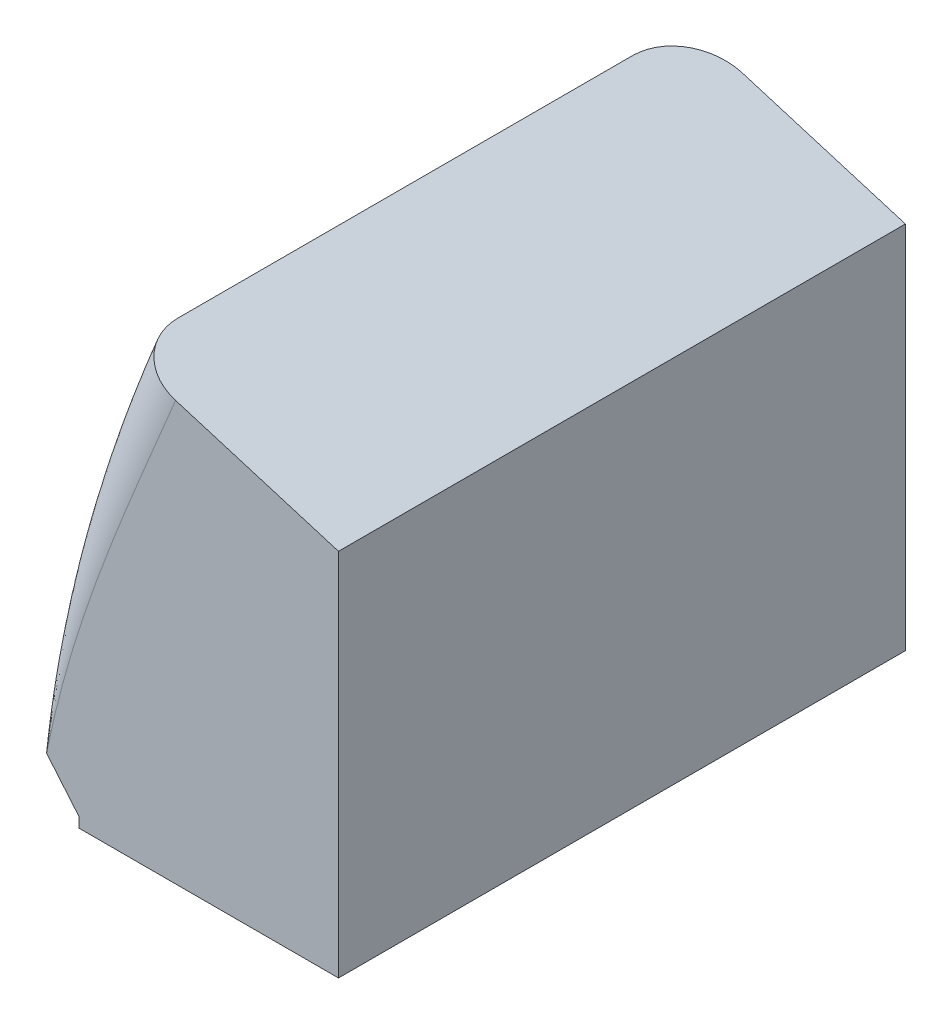
ISO-10303-21;
HEADER;
FILE_DESCRIPTION(('STEP AP214'),'2;1');
FILE_NAME('part.step','',(''),(''),'','','');
FILE_SCHEMA(('AUTOMOTIVE_DESIGN { 1 0 10303 214 1 1 1 1 }'));
ENDSEC;
DATA;
#1=APPLICATION_CONTEXT('core data for automotive mechanical design processes');
#2=APPLICATION_PROTOCOL_DEFINITION('international standard','automotive_design',2000,#1);
#3=PRODUCT_CONTEXT('',#1,'mechanical');
#4=PRODUCT('Part','Part','',(#3));
#5=PRODUCT_RELATED_PRODUCT_CATEGORY('part','',(#4));
#6=PRODUCT_DEFINITION_FORMATION('','',#4);
#7=PRODUCT_DEFINITION_CONTEXT('part definition',#1,'design');
#8=PRODUCT_DEFINITION('design','',#6,#7);
#9=PRODUCT_DEFINITION_SHAPE('','',#8);
#10=(LENGTH_UNIT() NAMED_UNIT(*) SI_UNIT(.MILLI.,.METRE.));
#11=(NAMED_UNIT(*) PLANE_ANGLE_UNIT() SI_UNIT($,.RADIAN.));
#12=(NAMED_UNIT(*) SI_UNIT($,.STERADIAN.) SOLID_ANGLE_UNIT());
#13=UNCERTAINTY_MEASURE_WITH_UNIT(LENGTH_MEASURE(1.E-05),#10,'distance_accuracy_value','');
#14=(GEOMETRIC_REPRESENTATION_CONTEXT(3) GLOBAL_UNCERTAINTY_ASSIGNED_CONTEXT((#13)) GLOBAL_UNIT_ASSIGNED_CONTEXT((#10,
#11,#12)) REPRESENTATION_CONTEXT('',''));
#15=CARTESIAN_POINT('',(0.,0.,0.));
#16=DIRECTION('',(0.,0.,1.));
#17=DIRECTION('',(1.,0.,0.));
#18=AXIS2_PLACEMENT_3D('',#15,#16,#17);
#19=CARTESIAN_POINT('',(95.5882845574575,273.5437759697,257.175));
#20=CARTESIAN_POINT('',(60.6402368125695,189.385982145259,257.175));
#21=CARTESIAN_POINT('',(61.5058752425657,98.2837759696998,257.175));
#22=B_SPLINE_CURVE_WITH_KNOTS('',2,(#19,#20,#21),.UNSPECIFIED.,.F.,.F.,(3,3),(0.,1.),.UNSPECIFIED.);
#23=DIRECTION('',(0.,0.,-1.));
#24=VECTOR('',#23,1.);
#25=SURFACE_OF_LINEAR_EXTRUSION('',#22,#24);
#26=DIRECTION('',(0.,0.,-1.));
#27=VECTOR('',#26,1.);
#28=CARTESIAN_POINT('',(95.5882845574577,273.5437759697,257.175));
#29=LINE('',#28,#27);
#30=CARTESIAN_POINT('',(95.588264985445,273.543781881419,231.774956698395));
#31=VERTEX_POINT('',#30);
#32=CARTESIAN_POINT('',(95.5882657697839,273.543783771622,25.4000433016045));
#33=VERTEX_POINT('',#32);
#34=EDGE_CURVE('E201',#31,#33,#29,.T.);
#35=ORIENTED_EDGE('',*,*,#34,.T.);
#36=CARTESIAN_POINT('',(95.5882845574575,273.5437759697,25.4000433016046));
#37=CARTESIAN_POINT('',(94.4669355544416,270.843545121834,25.3991844751417));
#38=CARTESIAN_POINT('',(93.3711387228895,268.132758442229,25.3689836402344));
#39=CARTESIAN_POINT('',(91.2155051493597,262.650235448777,25.2515531497168));
#40=CARTESIAN_POINT('',(90.1564739057308,259.878200792449,25.1634589968982));
#41=CARTESIAN_POINT('',(88.0774885910704,254.272570308684,24.9302617472996));
#42=CARTESIAN_POINT('',(87.0584024851546,251.438688949123,24.7842902716124));
#43=CARTESIAN_POINT('',(85.0624313160977,245.708731213309,24.4353347050176));
#44=CARTESIAN_POINT('',(84.0864780282691,242.812383550684,24.2314788114871));
#45=CARTESIAN_POINT('',(82.1799609578729,236.956834175116,23.7667692458027));
#46=CARTESIAN_POINT('',(81.250395045874,233.997376949346,23.5050415069592));
#47=CARTESIAN_POINT('',(79.5325042684236,228.320964619085,22.9542358437186));
#48=CARTESIAN_POINT('',(78.7389174252025,225.605178244672,22.6694824983411));
#49=CARTESIAN_POINT('',(77.1836498859295,220.086569913949,22.0513801699213));
#50=CARTESIAN_POINT('',(76.4234923226231,217.283446623488,21.7168905165962));
#51=CARTESIAN_POINT('',(74.9396578743869,211.589243690771,20.9992874441213));
#52=CARTESIAN_POINT('',(74.2175822381373,208.697884887769,20.6150809416491));
#53=CARTESIAN_POINT('',(72.8146098550993,202.826266946776,19.7979591406016));
#54=CARTESIAN_POINT('',(72.135394867675,199.845752478235,19.3639937924775));
#55=CARTESIAN_POINT('',(70.8229604446435,193.794809709112,18.4474495027146));
#56=CARTESIAN_POINT('',(70.1915058652976,190.724150710966,17.9638659513343));
#57=CARTESIAN_POINT('',(69.0756899390208,184.986364367502,17.0281221285283));
#58=CARTESIAN_POINT('',(68.582947932322,182.320136896709,16.5803960225914));
#59=CARTESIAN_POINT('',(67.6240526964103,176.847524464777,15.6384720900408));
#60=CARTESIAN_POINT('',(67.1605150230572,174.040888588837,15.1430690098953));
#61=CARTESIAN_POINT('',(66.2674889313087,168.285953429378,14.1057885020681));
#62=CARTESIAN_POINT('',(65.8407642154925,165.337421824623,13.5628228568529));
#63=CARTESIAN_POINT('',(65.0291739628628,159.297125372612,12.430301375089));
#64=CARTESIAN_POINT('',(64.6472261275535,156.20515444549,11.8397556322978));
#65=CARTESIAN_POINT('',(63.9333492858512,149.876333871888,10.6118869311581));
#66=CARTESIAN_POINT('',(63.6044984850333,146.639312153515,9.97365915175349));
#67=CARTESIAN_POINT('',(63.0594317745815,140.616610050512,8.77022550516866));
#68=CARTESIAN_POINT('',(62.8338872240802,137.831303998197,8.20733288352423));
#69=CARTESIAN_POINT('',(62.4155601861616,131.983892052329,7.01643098255456));
#70=CARTESIAN_POINT('',(62.2282049709997,128.92158714187,6.38747611535701));
#71=CARTESIAN_POINT('',(61.9888944392348,124.222805125017,5.4168010528212));
#72=CARTESIAN_POINT('',(61.9145276198504,122.586873423778,5.07780732311162));
#73=CARTESIAN_POINT('',(61.8048913452997,119.84726616459,4.50828194596324));
#74=CARTESIAN_POINT('',(61.7647746573386,118.743655801729,4.27835966415014));
#75=CARTESIAN_POINT('',(61.6366202808816,114.824128619779,3.46077708115048));
#76=CARTESIAN_POINT('',(61.570784868091,112.007785067445,2.87147324750928));
#77=CARTESIAN_POINT('',(61.5066658440771,107.476409359178,1.92322144999937));
#78=CARTESIAN_POINT('',(61.4920310102736,105.761566741349,1.56434728404532));
#79=CARTESIAN_POINT('',(61.4812898810265,102.125730354694,0.803577012265104));
#80=CARTESIAN_POINT('',(61.4876214446701,100.204726641671,0.401693293487655));
#81=CARTESIAN_POINT('',(61.5058752425657,98.2837759696998,0.));
#82=B_SPLINE_CURVE_WITH_KNOTS('',3,(#36,#37,#38,#39,#40,#41,#42,#43,#44,#45,#46,#47,#48,#49,#50,
#51,#52,#53,#54,#55,#56,#57,#58,#59,#60,#61,#62,#63,#64,#65,#66,#67,#68,#69,#70,#71,#72,#73,#74,
#75,#76,#77,#78,#79,#80,#81),.UNSPECIFIED.,.F.,.F.,(4,2,2,2,2,2,2,2,2,2,2,2,2,2,2,2,2,2,2,2,2,2,
4),(0.,8.77109507199565,17.6762356247577,26.7203748157598,35.9086966716123,45.2466358794777,
53.7767821999063,62.5466196002306,71.5602145596079,80.8220476349451,90.3370592572105,
98.5807824086005,107.242561004646,116.326839023496,125.838929387609,135.785123004129,
144.33630775611,153.731103982686,158.748035174236,162.132075841581,170.765780695358,
176.021850584176,181.909529398292),.UNSPECIFIED.);
#83=CARTESIAN_POINT('',(61.5058752425657,98.2837759696998,0.));
#84=VERTEX_POINT('',#83);
#85=EDGE_CURVE('E121',#33,#84,#82,.T.);
#86=ORIENTED_EDGE('',*,*,#85,.T.);
#87=DIRECTION('',(0.,0.,-1.));
#88=VECTOR('',#87,1.);
#89=CARTESIAN_POINT('',(61.5058752425657,98.2837759696998,257.175));
#90=LINE('',#89,#88);
#91=CARTESIAN_POINT('',(61.5058752425657,98.2837759696998,257.175));
#92=VERTEX_POINT('',#91);
#93=EDGE_CURVE('E122',#92,#84,#90,.T.);
#94=ORIENTED_EDGE('',*,*,#93,.F.);
#95=CARTESIAN_POINT('',(61.5058752425657,98.2837759696998,257.175));
#96=CARTESIAN_POINT('',(61.4876218642698,100.204682513747,256.773315949843));
#97=CARTESIAN_POINT('',(61.4812901720485,102.125642095119,256.371441477471));
#98=CARTESIAN_POINT('',(61.4920300618975,105.761412429923,255.610685077289));
#99=CARTESIAN_POINT('',(61.506664092132,107.476233125149,255.251815532906));
#100=CARTESIAN_POINT('',(61.5707811599114,112.007609108496,254.303563824707));
#101=CARTESIAN_POINT('',(61.6366160717654,114.823974865751,253.714255496233));
#102=CARTESIAN_POINT('',(61.76477146802,118.743568065276,252.896658847085));
#103=CARTESIAN_POINT('',(61.8048895899165,119.84722229977,252.666727295173));
#104=CARTESIAN_POINT('',(61.9145250926233,122.586810274609,252.097205623649));
#105=CARTESIAN_POINT('',(61.9888886976903,124.222678830466,251.758224729258));
#106=CARTESIAN_POINT('',(62.2281924393631,128.921366479971,250.787568881162));
#107=CARTESIAN_POINT('',(62.4155441287819,131.983640271323,250.158620859494));
#108=CARTESIAN_POINT('',(62.8338719586351,137.831115492537,248.9677058522));
#109=CARTESIAN_POINT('',(63.0594232509534,140.616515863579,248.404793786271));
#110=CARTESIAN_POINT('',(63.6044928349027,146.639249728692,247.201352773588));
#111=CARTESIAN_POINT('',(63.9333365976917,149.876208996371,246.563136184441));
#112=CARTESIAN_POINT('',(64.6472001974121,156.204936412408,245.335284526255));
#113=CARTESIAN_POINT('',(65.0291425546121,159.296876577804,244.744744784959));
#114=CARTESIAN_POINT('',(65.8407247810751,165.337142692223,243.612229134178));
#115=CARTESIAN_POINT('',(66.2674476155867,168.285674671369,243.06926354023));
#116=CARTESIAN_POINT('',(67.1604748264487,174.040641473616,242.031977351207));
#117=CARTESIAN_POINT('',(67.6240161090495,176.847308566862,241.53656878802));
#118=CARTESIAN_POINT('',(68.5829251896304,182.320013843593,240.594627150236));
#119=CARTESIAN_POINT('',(69.0756779863301,184.986302903339,240.146889172363));
#120=CARTESIAN_POINT('',(70.1914936375284,190.724087833649,239.211142829181));
#121=CARTESIAN_POINT('',(70.8229346122078,193.794684102395,238.727567271039));
#122=CARTESIAN_POINT('',(72.1353459654122,199.84553334945,237.81103519546));
#123=CARTESIAN_POINT('',(72.8145521872684,202.826016922917,237.377074402559));
#124=CARTESIAN_POINT('',(74.217513215215,208.697604461322,236.559956871094));
#125=CARTESIAN_POINT('',(74.9395869265214,211.588963653761,236.175750489786));
#126=CARTESIAN_POINT('',(76.4234256800861,217.28319844748,235.458143316643));
#127=CARTESIAN_POINT('',(77.1835901032845,220.086353100251,235.123649882547));
#128=CARTESIAN_POINT('',(78.7388813449394,225.605054776557,234.505534455137));
#129=CARTESIAN_POINT('',(79.532485627486,228.32090302386,234.220772318367));
#130=CARTESIAN_POINT('',(81.250386533598,233.997348822444,233.669958830163));
#131=CARTESIAN_POINT('',(82.1799433253713,236.95677804343,233.408230499514));
#132=CARTESIAN_POINT('',(84.0864455418984,242.812285718906,232.943520434091));
#133=CARTESIAN_POINT('',(85.0623933921805,245.708619606061,232.739664848929));
#134=CARTESIAN_POINT('',(87.058357961976,251.438563827479,232.390709416541));
#135=CARTESIAN_POINT('',(88.077443192035,254.272445363813,232.244738020665));
#136=CARTESIAN_POINT('',(90.1564319260492,259.878090095896,232.011540731247));
#137=CARTESIAN_POINT('',(91.2154677400328,262.650138732883,231.923446728419));
#138=CARTESIAN_POINT('',(93.3711164836426,268.132703428668,231.806016227941));
#139=CARTESIAN_POINT('',(94.4669241790481,270.8435177322,231.775815525231));
#140=CARTESIAN_POINT('',(95.5882845574575,273.5437759697,231.774956698395));
#141=B_SPLINE_CURVE_WITH_KNOTS('',3,(#95,#96,#97,#98,#99,#100,#101,#102,#103,#104,#105,#106,
#107,#108,#109,#110,#111,#112,#113,#114,#115,#116,#117,#118,#119,#120,#121,#122,#123,#124,#125,
#126,#127,#128,#129,#130,#131,#132,#133,#134,#135,#136,#137,#138,#139,#140),.UNSPECIFIED.,.F.,
.F.,(4,2,2,2,2,2,2,2,2,2,2,2,2,2,2,2,2,2,2,2,2,2,4),(0.,5.88754355576731,11.1435462173996,
19.7773189709371,23.1614942237117,28.1782318794553,37.5729320905495,46.1244063882036,
56.0704085968164,65.5824036560611,74.6666819451804,83.3285561231219,91.5724701130668,
101.087287823906,110.349023729084,119.362618377615,128.132552637448,136.662893448361,
146.000744778402,155.189022274675,164.23316105559,173.138345638221,181.909529712392),.UNSPECIFIED.);
#142=EDGE_CURVE('E113',#92,#31,#141,.T.);
#143=ORIENTED_EDGE('',*,*,#142,.T.);
#144=EDGE_LOOP('',(#35,#86,#94,#143));
#145=FACE_BOUND('',#144,.T.);
#146=ADVANCED_FACE('F43',(#145),#25,.F.);
#147=CARTESIAN_POINT('',(76.2,80.772,257.175));
#148=DIRECTION('',(0.766044443118978,0.642787609686539,0.));
#149=DIRECTION('',(-0.642787609686539,0.766044443118978,0.));
#150=AXIS2_PLACEMENT_3D('',#147,#148,#149);
#151=PLANE('',#150);
#152=DIRECTION('',(0.642787609686539,-0.766044443118978,0.));
#153=VECTOR('',#152,1.);
#154=CARTESIAN_POINT('',(76.2,80.772,0.));
#155=LINE('',#154,#153);
#156=CARTESIAN_POINT('',(76.2,80.772,0.));
#157=VERTEX_POINT('',#156);
#158=EDGE_CURVE('E160',#84,#157,#155,.T.);
#159=ORIENTED_EDGE('',*,*,#158,.T.);
#160=DIRECTION('',(0.,0.,-1.));
#161=VECTOR('',#160,1.);
#162=CARTESIAN_POINT('',(76.2,80.772,257.175));
#163=LINE('',#162,#161);
#164=CARTESIAN_POINT('',(76.2,80.772,257.175));
#165=VERTEX_POINT('',#164);
#166=EDGE_CURVE('E137',#165,#157,#163,.T.);
#167=ORIENTED_EDGE('',*,*,#166,.F.);
#168=DIRECTION('',(0.642787609686539,-0.766044443118978,0.));
#169=VECTOR('',#168,1.);
#170=CARTESIAN_POINT('',(76.2,80.772,257.175));
#171=LINE('',#170,#169);
#172=EDGE_CURVE('E128',#92,#165,#171,.T.);
#173=ORIENTED_EDGE('',*,*,#172,.F.);
#174=ORIENTED_EDGE('',*,*,#93,.T.);
#175=EDGE_LOOP('',(#159,#167,#173,#174));
#176=FACE_BOUND('',#175,.T.);
#177=ADVANCED_FACE('F135',(#176),#151,.F.);
#178=CARTESIAN_POINT('',(76.2,76.2,257.175));
#179=DIRECTION('',(1.,0.,0.));
#180=DIRECTION('',(0.,1.,0.));
#181=AXIS2_PLACEMENT_3D('',#178,#179,#180);
#182=PLANE('',#181);
#183=DIRECTION('',(0.,-1.,0.));
#184=VECTOR('',#183,1.);
#185=CARTESIAN_POINT('',(76.2,76.2,0.));
#186=LINE('',#185,#184);
#187=CARTESIAN_POINT('',(76.2,76.2,0.));
#188=VERTEX_POINT('',#187);
#189=EDGE_CURVE('E196',#157,#188,#186,.T.);
#190=ORIENTED_EDGE('',*,*,#189,.T.);
#191=DIRECTION('',(0.,0.,-1.));
#192=VECTOR('',#191,1.);
#193=CARTESIAN_POINT('',(76.2,76.2,257.175));
#194=LINE('',#193,#192);
#195=CARTESIAN_POINT('',(76.2,76.2,257.175));
#196=VERTEX_POINT('',#195);
#197=EDGE_CURVE('E149',#196,#188,#194,.T.);
#198=ORIENTED_EDGE('',*,*,#197,.F.);
#199=DIRECTION('',(0.,-1.,0.));
#200=VECTOR('',#199,1.);
#201=CARTESIAN_POINT('',(76.2,76.2,257.175));
#202=LINE('',#201,#200);
#203=EDGE_CURVE('E140',#165,#196,#202,.T.);
#204=ORIENTED_EDGE('',*,*,#203,.F.);
#205=ORIENTED_EDGE('',*,*,#166,.T.);
#206=EDGE_LOOP('',(#190,#198,#204,#205));
#207=FACE_BOUND('',#206,.T.);
#208=ADVANCED_FACE('F236',(#207),#182,.F.);
#209=CARTESIAN_POINT('',(193.929,76.2,257.175));
#210=DIRECTION('',(0.,1.,0.));
#211=DIRECTION('',(-1.,0.,0.));
#212=AXIS2_PLACEMENT_3D('',#209,#210,#211);
#213=PLANE('',#212);
#214=DIRECTION('',(1.,0.,0.));
#215=VECTOR('',#214,1.);
#216=CARTESIAN_POINT('',(193.929,76.2,0.));
#217=LINE('',#216,#215);
#218=CARTESIAN_POINT('',(193.929,76.2,0.));
#219=VERTEX_POINT('',#218);
#220=EDGE_CURVE('E249',#188,#219,#217,.T.);
#221=ORIENTED_EDGE('',*,*,#220,.T.);
#222=DIRECTION('',(0.,0.,-1.));
#223=VECTOR('',#222,1.);
#224=CARTESIAN_POINT('',(193.929,76.2,257.175));
#225=LINE('',#224,#223);
#226=CARTESIAN_POINT('',(193.929,76.2,257.175));
#227=VERTEX_POINT('',#226);
#228=EDGE_CURVE('E253',#227,#219,#225,.T.);
#229=ORIENTED_EDGE('',*,*,#228,.F.);
#230=DIRECTION('',(1.,0.,0.));
#231=VECTOR('',#230,1.);
#232=CARTESIAN_POINT('',(193.929,76.2,257.175));
#233=LINE('',#232,#231);
#234=EDGE_CURVE('E188',#196,#227,#233,.T.);
#235=ORIENTED_EDGE('',*,*,#234,.F.);
#236=ORIENTED_EDGE('',*,*,#197,.T.);
#237=EDGE_LOOP('',(#221,#229,#235,#236));
#238=FACE_BOUND('',#237,.T.);
#239=ADVANCED_FACE('F233',(#238),#213,.F.);
#240=CARTESIAN_POINT('',(193.928999999999,243.84,257.175));
#241=DIRECTION('',(-1.,0.,0.));
#242=DIRECTION('',(0.,-1.,0.));
#243=AXIS2_PLACEMENT_3D('',#240,#241,#242);
#244=PLANE('',#243);
#245=DIRECTION('',(0.,1.,0.));
#246=VECTOR('',#245,1.);
#247=CARTESIAN_POINT('',(193.928999999999,243.84,0.));
#248=LINE('',#247,#246);
#249=CARTESIAN_POINT('',(193.928999999999,243.84,0.));
#250=VERTEX_POINT('',#249);
#251=EDGE_CURVE('E256',#219,#250,#248,.T.);
#252=ORIENTED_EDGE('',*,*,#251,.T.);
#253=DIRECTION('',(0.,0.,-1.));
#254=VECTOR('',#253,1.);
#255=CARTESIAN_POINT('',(193.928999999999,243.84,257.175));
#256=LINE('',#255,#254);
#257=CARTESIAN_POINT('',(193.928999999999,243.84,257.175));
#258=VERTEX_POINT('',#257);
#259=EDGE_CURVE('E271',#258,#250,#256,.T.);
#260=ORIENTED_EDGE('',*,*,#259,.F.);
#261=DIRECTION('',(0.,1.,0.));
#262=VECTOR('',#261,1.);
#263=CARTESIAN_POINT('',(193.928999999999,243.84,257.175));
#264=LINE('',#263,#262);
#265=EDGE_CURVE('E191',#227,#258,#264,.T.);
#266=ORIENTED_EDGE('',*,*,#265,.F.);
#267=ORIENTED_EDGE('',*,*,#228,.T.);
#268=EDGE_LOOP('',(#252,#260,#266,#267));
#269=FACE_BOUND('',#268,.T.);
#270=ADVANCED_FACE('F219',(#269),#244,.F.);
#271=CARTESIAN_POINT('',(95.5882845574577,273.5437759697,257.175));
#272=DIRECTION('',(-0.289147444131922,-0.957284573965327,0.));
#273=DIRECTION('',(0.957284573965327,-0.289147444131922,0.));
#274=AXIS2_PLACEMENT_3D('',#271,#272,#273);
#275=PLANE('',#274);
#276=DIRECTION('',(-0.957284573965327,0.289147444131922,0.));
#277=VECTOR('',#276,1.);
#278=CARTESIAN_POINT('',(95.5882845574577,273.5437759697,0.));
#279=LINE('',#278,#277);
#280=CARTESIAN_POINT('',(120.026041570198,266.162360690771,0.));
#281=VERTEX_POINT('',#280);
#282=EDGE_CURVE('E141',#250,#281,#279,.T.);
#283=ORIENTED_EDGE('',*,*,#282,.T.);
#284=CARTESIAN_POINT('',(95.5882454134322,273.543787793138,25.4000433004201));
#285=CARTESIAN_POINT('',(95.5882424802218,273.543789904131,25.0735391173107));
#286=CARTESIAN_POINT('',(95.5943125269985,273.541983306185,24.7470351324434));
#287=CARTESIAN_POINT('',(95.6186542909527,273.53471158155,24.0921249951368));
#288=CARTESIAN_POINT('',(95.6370151525021,273.529219725237,23.7637224501947));
#289=CARTESIAN_POINT('',(95.6861535997146,273.514487860613,23.1057780294862));
#290=CARTESIAN_POINT('',(95.7170113407284,273.505223654202,22.7762426803452));
#291=CARTESIAN_POINT('',(95.7912986899985,273.482883359485,22.1168214915786));
#292=CARTESIAN_POINT('',(95.8347988002723,273.469785891474,21.7869443175946));
#293=CARTESIAN_POINT('',(95.9344685992265,273.439738584936,21.1276487870887));
#294=CARTESIAN_POINT('',(95.9906986111862,273.4227704012,20.7982403852364));
#295=CARTESIAN_POINT('',(96.1158645614463,273.384966578276,20.1407056668998));
#296=CARTESIAN_POINT('',(96.1848502234338,273.364115801756,19.8125896853512));
#297=CARTESIAN_POINT('',(96.3355011558779,273.318557705083,19.1584703574871));
#298=CARTESIAN_POINT('',(96.4172052557874,273.293838573552,18.8324767764433));
#299=CARTESIAN_POINT('',(96.593203055157,273.240581024641,18.183432806354));
#300=CARTESIAN_POINT('',(96.6875245267597,273.212034181735,17.8603906390634));
#301=CARTESIAN_POINT('',(96.8886032151482,273.151185901449,17.2180737516323));
#302=CARTESIAN_POINT('',(96.9953771205579,273.118879425575,16.8988047338291));
#303=CARTESIAN_POINT('',(97.221143903366,273.050600409399,16.2648416351983));
#304=CARTESIAN_POINT('',(97.3401424984461,273.014626153678,15.9501497744543));
#305=CARTESIAN_POINT('',(97.5803739624023,272.942067764,15.3503687584091));
#306=CARTESIAN_POINT('',(97.7007071966078,272.905750478918,15.0648864656543));
#307=CARTESIAN_POINT('',(97.9534550410385,272.82949648758,14.4940949780711));
#308=CARTESIAN_POINT('',(98.0860359520722,272.789510032185,14.2088660298184));
#309=CARTESIAN_POINT('',(98.3635145160225,272.70581949917,13.6393521741914));
#310=CARTESIAN_POINT('',(98.5085732892779,272.662066782098,13.3551529144709));
#311=CARTESIAN_POINT('',(98.8111939518894,272.570769012738,12.7885081165359));
#312=CARTESIAN_POINT('',(98.968910820343,272.523176898312,12.5061529180212));
#313=CARTESIAN_POINT('',(99.2969774393696,272.424148962974,11.9440432734106));
#314=CARTESIAN_POINT('',(99.4674750570809,272.37266807164,11.6643830602859));
#315=CARTESIAN_POINT('',(99.8211717608776,272.265837179609,11.1085416554798));
#316=CARTESIAN_POINT('',(100.004510686154,272.210444498979,10.8324576418227));
#317=CARTESIAN_POINT('',(100.383892563594,272.095792823484,10.2846723900614));
#318=CARTESIAN_POINT('',(100.580066476351,272.036493908198,10.0130702014557));
#319=CARTESIAN_POINT('',(100.985050501553,271.914060204549,9.47517022959214));
#320=CARTESIAN_POINT('',(101.193981932006,271.850888553872,9.20897216480919));
#321=CARTESIAN_POINT('',(101.624340035691,271.720776726484,8.68281445230687));
#322=CARTESIAN_POINT('',(101.845877738998,271.653803082142,8.4229539083501));
#323=CARTESIAN_POINT('',(102.301228570147,271.516161375571,7.91040079622124));
#324=CARTESIAN_POINT('',(102.535141892843,271.445463188294,7.65780525612141));
#325=CARTESIAN_POINT('',(102.963579139541,271.31608463818,7.21395426275378));
#326=CARTESIAN_POINT('',(103.156285433808,271.257930403264,7.02078602097327));
#327=CARTESIAN_POINT('',(103.556673598607,271.137170971155,6.63245201130651));
#328=CARTESIAN_POINT('',(103.764636858374,271.07448399281,6.43760149194997));
#329=CARTESIAN_POINT('',(104.19596149566,270.944468981624,6.04722047292779));
#330=CARTESIAN_POINT('',(104.419600004124,270.877057431623,5.85202397408286));
#331=CARTESIAN_POINT('',(104.88261786921,270.737454386955,5.46236679107729));
#332=CARTESIAN_POINT('',(105.122267747438,270.665179922105,5.26825718541395));
#333=CARTESIAN_POINT('',(105.617541097569,270.515750080405,4.88228466161083));
#334=CARTESIAN_POINT('',(105.873425456708,270.43851360823,4.69078782756071));
#335=CARTESIAN_POINT('',(106.401273487191,270.279100594462,4.31163445247021));
#336=CARTESIAN_POINT('',(106.673485416243,270.19684603841,4.12435623759828));
#337=CARTESIAN_POINT('',(107.233961632614,270.027416764385,3.75530323122454));
#338=CARTESIAN_POINT('',(107.522459017694,269.940169307215,3.57391576131497));
#339=CARTESIAN_POINT('',(108.115326501266,269.760843889994,3.21835780514046));
#340=CARTESIAN_POINT('',(108.419912003608,269.66869985837,3.04457966194851));
#341=CARTESIAN_POINT('',(109.04459680913,269.479733603442,2.70598548818679));
#342=CARTESIAN_POINT('',(109.364891214434,269.382852784221,2.54156225121615));
#343=CARTESIAN_POINT('',(110.020467369203,269.184608019241,2.22341851985664));
#344=CARTESIAN_POINT('',(110.355922398655,269.083192960982,2.07008594730971));
#345=CARTESIAN_POINT('',(110.878716005829,268.925319749822,1.84559053112566));
#346=CARTESIAN_POINT('',(111.063852534422,268.86944606992,1.76883798940566));
#347=CARTESIAN_POINT('',(111.512493520623,268.734030124342,1.58942008245334));
#348=CARTESIAN_POINT('',(111.776862260988,268.654219866052,1.48910565381234));
#349=CARTESIAN_POINT('',(112.384378078432,268.470740238412,1.27085613927249));
#350=CARTESIAN_POINT('',(112.728542771891,268.366741836106,1.15602566051986));
#351=CARTESIAN_POINT('',(113.49530656269,268.135051643421,0.919562036781099));
#352=CARTESIAN_POINT('',(113.918977608769,268.00703756244,0.801702119307195));
#353=CARTESIAN_POINT('',(114.730980856876,267.761695143831,0.599982004080599));
#354=CARTESIAN_POINT('',(115.11882030177,267.644514934588,0.513948831309923));
#355=CARTESIAN_POINT('',(115.866205227644,267.418652430005,0.36782020534706));
#356=CARTESIAN_POINT('',(116.225475441532,267.310057442786,0.306180547098062));
#357=CARTESIAN_POINT('',(116.915129842083,267.101653185541,0.204256888041927));
#358=CARTESIAN_POINT('',(117.245325570905,267.001896170053,0.162587163954292));
#359=CARTESIAN_POINT('',(117.876676629247,266.811213784417,0.0964744752670022));
#360=CARTESIAN_POINT('',(118.177712709103,266.720319102134,0.0708004918443956));
#361=CARTESIAN_POINT('',(118.750924497062,266.547285800707,0.0330162145493288));
#362=CARTESIAN_POINT('',(119.023033922413,266.465163076396,0.0198222773734172));
#363=CARTESIAN_POINT('',(119.538796604587,266.309483005956,0.00378613975255856));
#364=CARTESIAN_POINT('',(119.782423857132,266.235935902786,-1.18225886224314E-06));
#365=CARTESIAN_POINT('',(120.026041570198,266.162360690771,0.));
#366=B_SPLINE_CURVE_WITH_KNOTS('',3,(#284,#285,#286,#287,#288,#289,#290,#291,#292,#293,#294,
#295,#296,#297,#298,#299,#300,#301,#302,#303,#304,#305,#306,#307,#308,#309,#310,#311,#312,#313,
#314,#315,#316,#317,#318,#319,#320,#321,#322,#323,#324,#325,#326,#327,#328,#329,#330,#331,#332,
#333,#334,#335,#336,#337,#338,#339,#340,#341,#342,#343,#344,#345,#346,#347,#348,#349,#350,#351,
#352,#353,#354,#355,#356,#357,#358,#359,#360,#361,#362,#363,#364,#365),.UNSPECIFIED.,.F.,.F.,(4,
2,2,2,2,2,2,2,2,2,2,2,2,2,2,2,2,2,2,2,2,2,2,2,2,2,2,2,2,2,2,2,2,2,2,2,2,2,2,2,4),(0.,
0.979451090651386,1.96608416678512,2.95914837592029,3.95786045071002,4.96140804794422,
5.9689534328075,6.97963747420307,7.99258390980894,9.00690383306098,10.0217003486755,
10.9572757267296,11.9082556804084,12.8742159056158,13.8546738994415,14.8490883581351,
15.8568590587981,16.8773272640332,17.9097766813318,18.953434999778,20.0074760157998,
20.8442828846218,21.719497390893,22.6325069744324,23.5825544766117,24.5687270098076,
25.589946086846,26.6449660545386,27.7323651209928,28.8505369235859,29.9976940419922,
30.6218204007737,31.5030656929007,32.634985271063,34.0083381046093,35.2504264283264,
36.3911035120189,37.4331480548802,38.3794498458579,39.2329059168789,39.9963375783692),.UNSPECIFIED.);
#367=EDGE_CURVE('E58',#281,#33,#366,.F.);
#368=ORIENTED_EDGE('',*,*,#367,.T.);
#369=ORIENTED_EDGE('',*,*,#34,.F.);
#370=CARTESIAN_POINT('',(120.026041570198,266.162360690771,257.175));
#371=CARTESIAN_POINT('',(119.77489594246,266.23821020421,257.175001371036));
#372=CARTESIAN_POINT('',(119.523741525618,266.314034967056,257.17097626152));
#373=CARTESIAN_POINT('',(118.993372980781,266.474139842645,257.153975800616));
#374=CARTESIAN_POINT('',(118.714186214315,266.558409889976,257.140042963912));
#375=CARTESIAN_POINT('',(118.127303337073,266.735592953174,257.100256868564));
#376=CARTESIAN_POINT('',(117.819675980695,266.828489152259,257.073310320003));
#377=CARTESIAN_POINT('',(117.175671749628,267.023010733949,257.004103127276));
#378=CARTESIAN_POINT('',(116.839417413188,267.124603746775,256.960605122314));
#379=CARTESIAN_POINT('',(116.192430769622,267.320114957726,256.862667790627));
#380=CARTESIAN_POINT('',(115.881561397366,267.414072030942,256.809208941598));
#381=CARTESIAN_POINT('',(115.239078506112,267.608212638966,256.685415438404));
#382=CARTESIAN_POINT('',(114.907633424357,267.708342063297,256.614124295796));
#383=CARTESIAN_POINT('',(114.072055056575,267.960808925596,256.415490249901));
#384=CARTESIAN_POINT('',(113.569990058022,268.112542299174,256.27851940168));
#385=CARTESIAN_POINT('',(112.680329161432,268.381397263765,256.004051189465));
#386=CARTESIAN_POINT('',(112.290958895525,268.499058712926,255.872778663148));
#387=CARTESIAN_POINT('',(111.655540207672,268.690924571112,255.640083781247));
#388=CARTESIAN_POINT('',(111.407528106374,268.76577455503,255.544534490715));
#389=CARTESIAN_POINT('',(110.998110628177,268.889317234726,255.378901323981));
#390=CARTESIAN_POINT('',(110.83583437117,268.938279336251,255.311159024172));
#391=CARTESIAN_POINT('',(110.336120732406,269.089155695789,255.096033858364));
#392=CARTESIAN_POINT('',(110.001102973635,269.190451857261,254.942535007308));
#393=CARTESIAN_POINT('',(109.346361944207,269.388453081966,254.624086011667));
#394=CARTESIAN_POINT('',(109.02646598908,269.48520951798,254.459521759932));
#395=CARTESIAN_POINT('',(108.402540404842,269.673942856418,254.120664252066));
#396=CARTESIAN_POINT('',(108.098316262926,269.765978058534,253.946761784286));
#397=CARTESIAN_POINT('',(107.506131104096,269.945097304671,253.590967266068));
#398=CARTESIAN_POINT('',(107.217955391852,270.032247224337,253.409465562465));
#399=CARTESIAN_POINT('',(106.658081271301,270.201493698532,253.040189230667));
#400=CARTESIAN_POINT('',(106.386150548952,270.283662754444,252.852799979174));
#401=CARTESIAN_POINT('',(105.858824046279,270.442917867508,252.473423091681));
#402=CARTESIAN_POINT('',(105.603180834297,270.520081654403,252.281811917864));
#403=CARTESIAN_POINT('',(105.108349431319,270.669378660555,251.895603108433));
#404=CARTESIAN_POINT('',(104.868901217643,270.741592692735,251.701369790452));
#405=CARTESIAN_POINT('',(104.406247516979,270.881086883024,251.311451883136));
#406=CARTESIAN_POINT('',(104.182772387907,270.948449732672,251.116116719191));
#407=CARTESIAN_POINT('',(103.751736944875,271.078378656453,250.725439912267));
#408=CARTESIAN_POINT('',(103.543900375,271.141027983526,250.530430740783));
#409=CARTESIAN_POINT('',(103.143729877422,271.261722478895,250.14175638769));
#410=CARTESIAN_POINT('',(102.95111541726,271.319849198453,249.948405055131));
#411=CARTESIAN_POINT('',(102.52285934289,271.44917325433,249.504106913374));
#412=CARTESIAN_POINT('',(102.289038824123,271.519843362781,249.25124637461));
#413=CARTESIAN_POINT('',(101.833882873957,271.657426266802,248.738162126957));
#414=CARTESIAN_POINT('',(101.612447284707,271.724369174965,248.478035268043));
#415=CARTESIAN_POINT('',(101.182302820767,271.854416654716,247.951344311115));
#416=CARTESIAN_POINT('',(100.973482942833,271.91755468629,247.684879143616));
#417=CARTESIAN_POINT('',(100.568731589683,272.039918243468,247.146444904281));
#418=CARTESIAN_POINT('',(100.372678812029,272.099180626571,246.874575381959));
#419=CARTESIAN_POINT('',(99.9935488601361,272.213756279078,246.326255970641));
#420=CARTESIAN_POINT('',(99.8103407296211,272.269109467608,246.049904965701));
#421=CARTESIAN_POINT('',(99.4569153108427,272.375858405541,245.493530666297));
#422=CARTESIAN_POINT('',(99.2865581764199,272.427296836939,245.213604387144));
#423=CARTESIAN_POINT('',(98.9587822050335,272.526236893233,244.650964282505));
#424=CARTESIAN_POINT('',(98.8012154829171,272.573783593968,244.368344529159));
#425=CARTESIAN_POINT('',(98.4989047256278,272.664987617222,243.801172866686));
#426=CARTESIAN_POINT('',(98.3540056827235,272.708692010452,243.516711137589));
#427=CARTESIAN_POINT('',(98.07685607397,272.792283025922,242.946675169567));
#428=CARTESIAN_POINT('',(97.9444443490719,272.832218299369,242.661186418693));
#429=CARTESIAN_POINT('',(97.6920441932571,272.908367180736,242.089878638126));
#430=CARTESIAN_POINT('',(97.571889413673,272.944630551692,241.804139696015));
#431=CARTESIAN_POINT('',(97.3323959610702,273.01696596175,241.204707474277));
#432=CARTESIAN_POINT('',(97.2139244574341,273.052780771615,240.890636203745));
#433=CARTESIAN_POINT('',(96.9891587593233,273.120756673856,240.257944473702));
#434=CARTESIAN_POINT('',(96.8828589196808,273.152919459967,239.939326200818));
#435=CARTESIAN_POINT('',(96.6826732743399,273.213496999222,239.298335855665));
#436=CARTESIAN_POINT('',(96.5887709450206,273.241916741037,238.975969415885));
#437=CARTESIAN_POINT('',(96.4135548345901,273.29493732869,238.328296551185));
#438=CARTESIAN_POINT('',(96.3322135403506,273.319546521314,238.002998252322));
#439=CARTESIAN_POINT('',(96.1822306901465,273.364902355746,237.350283666926));
#440=CARTESIAN_POINT('',(96.1135506574159,273.385660701281,237.022877034756));
#441=CARTESIAN_POINT('',(95.9889380579469,273.423297416017,236.366769697123));
#442=CARTESIAN_POINT('',(95.9329562118279,273.440190786777,236.038079211125));
#443=CARTESIAN_POINT('',(95.8337250089653,273.470106131174,235.380222759178));
#444=CARTESIAN_POINT('',(95.7904158611355,273.483146287637,235.051066638132));
#445=CARTESIAN_POINT('',(95.716453407385,273.5053893108,234.393085498468));
#446=CARTESIAN_POINT('',(95.6857302142323,273.514613370417,234.064269051084));
#447=CARTESIAN_POINT('',(95.6368050329089,273.529281780907,233.407755274565));
#448=CARTESIAN_POINT('',(95.6185235802221,273.534750121392,233.080064401789));
#449=CARTESIAN_POINT('',(95.594286509251,273.541990922381,232.426565605137));
#450=CARTESIAN_POINT('',(95.5882425052931,273.543789885875,232.100761250399));
#451=CARTESIAN_POINT('',(95.5882454134322,273.543787793138,231.77495669958));
#452=B_SPLINE_CURVE_WITH_KNOTS('',3,(#370,#371,#372,#373,#374,#375,#376,#377,#378,#379,#380,
#381,#382,#383,#384,#385,#386,#387,#388,#389,#390,#391,#392,#393,#394,#395,#396,#397,#398,#399,
#400,#401,#402,#403,#404,#405,#406,#407,#408,#409,#410,#411,#412,#413,#414,#415,#416,#417,#418,
#419,#420,#421,#422,#423,#424,#425,#426,#427,#428,#429,#430,#431,#432,#433,#434,#435,#436,#437,
#438,#439,#440,#441,#442,#443,#444,#445,#446,#447,#448,#449,#450,#451),.UNSPECIFIED.,.F.,.F.,(4,
2,2,2,2,2,2,2,2,2,2,2,2,2,2,2,2,2,2,2,2,2,2,2,2,2,2,2,2,2,2,2,2,2,2,2,2,2,2,2,4),(0.,
0.787021430314397,1.66273206776298,2.62993073715886,3.69146946121574,4.67861043100654,
5.73884604473375,7.36390065420016,8.6456326166036,9.47384530859537,10.0214259881175,
11.1675354150776,12.2847723022058,13.3713572579473,14.4256908934945,15.4463574891026,
16.4321161461822,17.381892417754,18.2947766115582,19.1700140025801,20.0069938016338,
21.0614038869643,22.1054460116506,23.1382934022725,24.1591731422169,25.1673683060462,
26.1622195046344,27.1431258526518,28.1095453808553,29.0609949248682,29.9970495296073,
31.0095098923938,32.0214987617373,33.0321249169183,34.0405050458846,35.0457683518502,
36.0470609937686,37.043550308065,38.0344287644898,39.0189176153105,39.9962702040725),.UNSPECIFIED.);
#453=CARTESIAN_POINT('',(120.026041570198,266.162360690771,257.175));
#454=VERTEX_POINT('',#453);
#455=EDGE_CURVE('E65',#31,#454,#452,.F.);
#456=ORIENTED_EDGE('',*,*,#455,.T.);
#457=DIRECTION('',(-0.957284573965327,0.289147444131922,0.));
#458=VECTOR('',#457,1.);
#459=CARTESIAN_POINT('',(95.5882845574577,273.5437759697,257.175));
#460=LINE('',#459,#458);
#461=EDGE_CURVE('E130',#258,#454,#460,.T.);
#462=ORIENTED_EDGE('',*,*,#461,.F.);
#463=ORIENTED_EDGE('',*,*,#259,.T.);
#464=EDGE_LOOP('',(#283,#368,#369,#456,#462,#463));
#465=FACE_BOUND('',#464,.T.);
#466=ADVANCED_FACE('F210',(#465),#275,.F.);
#467=CARTESIAN_POINT('',(69.5936583562905,187.649879057479,257.175));
#468=DIRECTION('',(0.,0.,1.));
#469=DIRECTION('',(1.,0.,0.));
#470=AXIS2_PLACEMENT_3D('',#467,#468,#469);
#471=PLANE('',#470);
#472=ORIENTED_EDGE('',*,*,#461,.T.);
#473=CARTESIAN_POINT('',(61.5058752425657,98.2837759696998,257.175));
#474=CARTESIAN_POINT('',(64.7333735101863,114.486177529708,257.175));
#475=CARTESIAN_POINT('',(68.8081951090086,130.153268002272,257.175));
#476=CARTESIAN_POINT('',(78.0680273963708,160.514588308018,257.175));
#477=CARTESIAN_POINT('',(83.2497222281092,175.205266622263,257.175));
#478=CARTESIAN_POINT('',(94.180757081885,203.934696397599,257.175));
#479=CARTESIAN_POINT('',(99.928122671104,217.97531405548,257.175));
#480=CARTESIAN_POINT('',(108.662047881703,238.961169159553,257.175));
#481=CARTESIAN_POINT('',(111.593329136082,245.945488216217,257.175));
#482=CARTESIAN_POINT('',(115.992819243229,256.468269047985,257.175));
#483=CARTESIAN_POINT('',(117.459827361432,259.983644626809,257.175));
#484=CARTESIAN_POINT('',(119.108784747072,263.953454616174,257.175));
#485=CARTESIAN_POINT('',(119.306206506334,264.428938230821,257.175));
#486=CARTESIAN_POINT('',(119.693810002257,265.362319555407,257.175));
#487=CARTESIAN_POINT('',(119.887611750225,265.829010217705,257.175));
#488=CARTESIAN_POINT('',(120.469016994111,267.229082204585,257.175));
#489=CARTESIAN_POINT('',(120.85662049004,268.162463529179,257.175));
#490=CARTESIAN_POINT('',(122.019430977832,270.962607502937,257.175));
#491=CARTESIAN_POINT('',(122.79463796968,272.829370152126,257.175));
#492=CARTESIAN_POINT('',(123.569844961538,274.6961328013,257.175));
#493=(BOUNDED_CURVE() B_SPLINE_CURVE(3,(#473,#474,#475,#476,#477,#478,#479,#480,#481,#482,#483,
#484,#485,#486,#487,#488,#489,#490,#491,#492),.UNSPECIFIED.,.F.,
.F.) B_SPLINE_CURVE_WITH_KNOTS((4,2,2,2,2,2,2,2,2,4),(-0.0647214368223329,0.20145892238325,
0.467639281588834,0.733819640794417,0.866909820397208,0.933454910198604,0.941773046423779,
0.950091182648953,0.966727455099302,1.),
.UNSPECIFIED.) CURVE() GEOMETRIC_REPRESENTATION_ITEM() RATIONAL_B_SPLINE_CURVE((1.,1.,1.,1.,1.,
1.,1.,1.,1.,1.,1.,1.,1.,1.,1.,1.,1.,1.,1.,1.)) REPRESENTATION_ITEM(''));
#494=EDGE_CURVE('E11',#454,#92,#493,.F.);
#495=ORIENTED_EDGE('',*,*,#494,.T.);
#496=ORIENTED_EDGE('',*,*,#172,.T.);
#497=ORIENTED_EDGE('',*,*,#203,.T.);
#498=ORIENTED_EDGE('',*,*,#234,.T.);
#499=ORIENTED_EDGE('',*,*,#265,.T.);
#500=EDGE_LOOP('',(#472,#495,#496,#497,#498,#499));
#501=FACE_BOUND('',#500,.T.);
#502=ADVANCED_FACE('F127',(#501),#471,.T.);
#503=CARTESIAN_POINT('',(69.5936583562905,187.649879057479,0.));
#504=DIRECTION('',(0.,0.,1.));
#505=DIRECTION('',(1.,0.,0.));
#506=AXIS2_PLACEMENT_3D('',#503,#504,#505);
#507=PLANE('',#506);
#508=ORIENTED_EDGE('',*,*,#158,.F.);
#509=CARTESIAN_POINT('',(123.569844961538,274.6961328013,0.));
#510=CARTESIAN_POINT('',(122.79463796968,272.829370152126,0.));
#511=CARTESIAN_POINT('',(122.019430977832,270.962607502937,0.));
#512=CARTESIAN_POINT('',(120.85662049004,268.162463529179,0.));
#513=CARTESIAN_POINT('',(120.469016994111,267.229082204585,0.));
#514=CARTESIAN_POINT('',(119.887611750225,265.829010217705,0.));
#515=CARTESIAN_POINT('',(119.693810002257,265.362319555407,0.));
#516=CARTESIAN_POINT('',(119.306206506334,264.428938230821,0.));
#517=CARTESIAN_POINT('',(119.108784747072,263.953454616174,0.));
#518=CARTESIAN_POINT('',(117.459827361432,259.983644626809,0.));
#519=CARTESIAN_POINT('',(115.992819243229,256.468269047985,0.));
#520=CARTESIAN_POINT('',(111.593329136082,245.945488216217,0.));
#521=CARTESIAN_POINT('',(108.662047881703,238.961169159553,0.));
#522=CARTESIAN_POINT('',(99.928122671104,217.97531405548,0.));
#523=CARTESIAN_POINT('',(94.180757081885,203.934696397599,0.));
#524=CARTESIAN_POINT('',(83.2497222281092,175.205266622263,0.));
#525=CARTESIAN_POINT('',(78.0680273963708,160.514588308018,0.));
#526=CARTESIAN_POINT('',(68.8081951090086,130.153268002272,0.));
#527=CARTESIAN_POINT('',(64.7333735101863,114.486177529708,0.));
#528=CARTESIAN_POINT('',(61.5058752425657,98.2837759696998,0.));
#529=(BOUNDED_CURVE() B_SPLINE_CURVE(3,(#509,#510,#511,#512,#513,#514,#515,#516,#517,#518,#519,
#520,#521,#522,#523,#524,#525,#526,#527,#528),.UNSPECIFIED.,.F.,
.F.) B_SPLINE_CURVE_WITH_KNOTS((4,2,2,2,2,2,2,2,2,4),(-0.0647214368223329,-0.031448891921635,
-0.014812619471286,-0.00649448324611154,0.00182365297906293,0.0683687427804587,0.20145892238325,
0.467639281588834,0.733819640794417,1.),
.UNSPECIFIED.) CURVE() GEOMETRIC_REPRESENTATION_ITEM() RATIONAL_B_SPLINE_CURVE((1.,1.,1.,1.,1.,
1.,1.,1.,1.,1.,1.,1.,1.,1.,1.,1.,1.,1.,1.,1.)) REPRESENTATION_ITEM(''));
#530=EDGE_CURVE('E74',#84,#281,#529,.F.);
#531=ORIENTED_EDGE('',*,*,#530,.T.);
#532=ORIENTED_EDGE('',*,*,#282,.F.);
#533=ORIENTED_EDGE('',*,*,#251,.F.);
#534=ORIENTED_EDGE('',*,*,#220,.F.);
#535=ORIENTED_EDGE('',*,*,#189,.F.);
#536=EDGE_LOOP('',(#508,#531,#532,#533,#534,#535));
#537=FACE_BOUND('',#536,.T.);
#538=ADVANCED_FACE('F220',(#537),#507,.F.);
#539=CARTESIAN_POINT('',(100.112060285827,284.437402641931,25.4));
#540=CARTESIAN_POINT('',(99.3368532939722,282.570639992755,25.4));
#541=CARTESIAN_POINT('',(98.561646302114,280.703877343571,25.4));
#542=CARTESIAN_POINT('',(97.3988358143326,277.903733369809,25.4));
#543=CARTESIAN_POINT('',(97.0112323184026,276.970352045214,25.4));
#544=CARTESIAN_POINT('',(96.4298270745131,275.570280058336,25.4));
#545=CARTESIAN_POINT('',(96.2360253265476,275.103589396038,25.4));
#546=CARTESIAN_POINT('',(95.8484218306213,274.170208071452,25.4));
#547=CARTESIAN_POINT('',(95.6543770073225,273.703564542404,25.4002583187409));
#548=CARTESIAN_POINT('',(93.9134209071229,269.502716526591,25.3967937572722));
#549=CARTESIAN_POINT('',(92.4187683466137,265.75837887233,25.3375779450366));
#550=CARTESIAN_POINT('',(88.0934025845533,254.494614323475,25.0027491426881));
#551=CARTESIAN_POINT('',(85.4212813018823,246.944435841296,24.569954786856));
#552=CARTESIAN_POINT('',(78.0392851305643,224.170894047292,22.7326641804907));
#553=CARTESIAN_POINT('',(73.9637779187191,208.824524388608,20.7892603899369));
#554=CARTESIAN_POINT('',(67.5044106323337,177.803768143048,15.9443949619043));
#555=CARTESIAN_POINT('',(65.120550558075,162.129381557465,13.0429333235648));
#556=CARTESIAN_POINT('',(62.0444775470596,130.452591458462,6.76098112401438));
#557=CARTESIAN_POINT('',(61.3522646104054,114.450187945984,3.3804905616686));
#558=CARTESIAN_POINT('',(61.5058752425657,98.2837759696998,0.));
#559=CARTESIAN_POINT('',(100.112060285827,284.437402641931,0.));
#560=CARTESIAN_POINT('',(99.3368532939693,282.570639992756,0.));
#561=CARTESIAN_POINT('',(98.5616463021208,280.703877343568,0.));
#562=CARTESIAN_POINT('',(97.3988358143292,277.90373336981,0.));
#563=CARTESIAN_POINT('',(97.0112323184,276.970352045215,-6.98511906057909E-12));
#564=CARTESIAN_POINT('',(96.4298270745143,275.570280058335,3.53419289371299E-12));
#565=CARTESIAN_POINT('',(96.2360253265463,275.103589396038,0.));
#566=CARTESIAN_POINT('',(95.8484218306226,274.170208071452,0.));
#567=CARTESIAN_POINT('',(95.6543770073204,273.703564542405,0.));
#568=CARTESIAN_POINT('',(93.91342090714,269.502716526584,0.));
#569=CARTESIAN_POINT('',(92.4187683465748,265.758378872345,1.39676495657999E-11));
#570=CARTESIAN_POINT('',(88.093402584631,254.494614323445,-2.78936657681764E-11));
#571=CARTESIAN_POINT('',(85.4212813019407,246.944435841277,-1.93790185275914E-10));
#572=CARTESIAN_POINT('',(78.0392851304475,224.170894047329,3.87622003915252E-10));
#573=CARTESIAN_POINT('',(73.9637779187121,208.82452438861,-3.84766697651981E-10));
#574=CARTESIAN_POINT('',(67.5044106323408,177.803768143047,3.8476669765198E-10));
#575=CARTESIAN_POINT('',(65.120550558019,162.12938155747,-3.31267604857846E-10));
#576=CARTESIAN_POINT('',(62.0444775471156,130.452591458457,3.31239849282231E-10));
#577=CARTESIAN_POINT('',(61.352264610605,114.45018794597,-3.71877026453542E-10));
#578=CARTESIAN_POINT('',(61.5058752425657,98.2837759696998,0.));
#579=CARTESIAN_POINT('',(123.569844961538,274.6961328013,0.));
#580=CARTESIAN_POINT('',(122.79463796968,272.829370152126,0.));
#581=CARTESIAN_POINT('',(122.019430977832,270.962607502937,0.));
#582=CARTESIAN_POINT('',(120.85662049004,268.162463529179,0.));
#583=CARTESIAN_POINT('',(120.469016994111,267.229082204585,0.));
#584=CARTESIAN_POINT('',(119.887611750225,265.829010217705,0.));
#585=CARTESIAN_POINT('',(119.693810002257,265.362319555407,0.));
#586=CARTESIAN_POINT('',(119.306206506334,264.428938230821,0.));
#587=CARTESIAN_POINT('',(119.108784747072,263.953454616174,0.));
#588=CARTESIAN_POINT('',(117.459827361432,259.983644626809,0.));
#589=CARTESIAN_POINT('',(115.992819243229,256.468269047985,0.));
#590=CARTESIAN_POINT('',(111.593329136082,245.945488216217,0.));
#591=CARTESIAN_POINT('',(108.662047881703,238.961169159553,0.));
#592=CARTESIAN_POINT('',(99.928122671104,217.97531405548,0.));
#593=CARTESIAN_POINT('',(94.180757081885,203.934696397599,0.));
#594=CARTESIAN_POINT('',(83.2497222281092,175.205266622263,0.));
#595=CARTESIAN_POINT('',(78.0680273963708,160.514588308018,0.));
#596=CARTESIAN_POINT('',(68.8081951090086,130.153268002272,0.));
#597=CARTESIAN_POINT('',(64.7333735101863,114.486177529708,0.));
#598=CARTESIAN_POINT('',(61.5058752425657,98.2837759696998,0.));
#599=(BOUNDED_SURFACE() B_SPLINE_SURFACE(2,3,((#539,#540,#541,#542,#543,#544,#545,#546,#547,
#548,#549,#550,#551,#552,#553,#554,#555,#556,#557,#558),(#559,#560,#561,#562,#563,#564,#565,
#566,#567,#568,#569,#570,#571,#572,#573,#574,#575,#576,#577,#578),(#579,#580,#581,#582,#583,
#584,#585,#586,#587,#588,#589,#590,#591,#592,#593,#594,#595,#596,#597,#598)),.UNSPECIFIED.,.F.,
.F.,.F.) B_SPLINE_SURFACE_WITH_KNOTS((3,3),(4,2,2,2,2,2,2,2,2,4),(0.,1.),(-0.0647214368223329,
-0.031448891921635,-0.014812619471286,-0.00649448324611154,0.00182365297906293,
0.0683687427804587,0.20145892238325,0.467639281588834,0.733819640794417,1.),
.UNSPECIFIED.) GEOMETRIC_REPRESENTATION_ITEM() RATIONAL_B_SPLINE_SURFACE(((1.,1.,1.,1.,1.,1.,1.,
1.,1.,1.,1.,1.,1.,1.,1.,1.,1.,1.,1.,1.),(0.707106781186548,0.707106781186548,0.707106781186548,
0.707106781186548,0.707106781186548,0.707106781186548,0.707106781186548,0.707106781186548,
0.707106781186547,0.707106781186547,0.707106781186548,0.707106781186548,0.707106781186547,
0.707106781186547,0.707106781186548,0.707106781186548,0.707106781186547,0.707106781186547,
0.707106781186549,0.707106781186548),(1.,1.,1.,1.,1.,1.,1.,1.,1.,1.,1.,1.,1.,1.,1.,1.,1.,1.,1.,1.))) REPRESENTATION_ITEM('') SURFACE());
#600=ORIENTED_EDGE('',*,*,#367,.F.);
#601=ORIENTED_EDGE('',*,*,#530,.F.);
#602=ORIENTED_EDGE('',*,*,#85,.F.);
#603=EDGE_LOOP('',(#600,#601,#602));
#604=FACE_BOUND('',#603,.T.);
#605=ADVANCED_FACE('F173',(#604),#599,.T.);
#606=CARTESIAN_POINT('',(123.569844961538,274.6961328013,257.175));
#607=CARTESIAN_POINT('',(122.79463796968,272.829370152126,257.175));
#608=CARTESIAN_POINT('',(122.019430977832,270.962607502937,257.175));
#609=CARTESIAN_POINT('',(120.85662049004,268.162463529179,257.175));
#610=CARTESIAN_POINT('',(120.469016994111,267.229082204585,257.175));
#611=CARTESIAN_POINT('',(119.887611750225,265.829010217705,257.175));
#612=CARTESIAN_POINT('',(119.693810002257,265.362319555407,257.175));
#613=CARTESIAN_POINT('',(119.306206506334,264.428938230821,257.175));
#614=CARTESIAN_POINT('',(119.108784747072,263.953454616174,257.175));
#615=CARTESIAN_POINT('',(117.459827361432,259.983644626809,257.175));
#616=CARTESIAN_POINT('',(115.992819243229,256.468269047985,257.175));
#617=CARTESIAN_POINT('',(111.593329136082,245.945488216217,257.175));
#618=CARTESIAN_POINT('',(108.662047881703,238.961169159553,257.175));
#619=CARTESIAN_POINT('',(99.928122671104,217.97531405548,257.175));
#620=CARTESIAN_POINT('',(94.180757081885,203.934696397599,257.175));
#621=CARTESIAN_POINT('',(83.2497222281092,175.205266622263,257.175));
#622=CARTESIAN_POINT('',(78.0680273963708,160.514588308018,257.175));
#623=CARTESIAN_POINT('',(68.8081951090086,130.153268002272,257.175));
#624=CARTESIAN_POINT('',(64.7333735101863,114.486177529708,257.175));
#625=CARTESIAN_POINT('',(61.5058752425657,98.2837759696998,257.175));
#626=CARTESIAN_POINT('',(100.112060285827,284.437402641931,257.175));
#627=CARTESIAN_POINT('',(99.3368532939693,282.570639992756,257.175));
#628=CARTESIAN_POINT('',(98.5616463021208,280.703877343568,257.175));
#629=CARTESIAN_POINT('',(97.3988358143292,277.90373336981,257.175));
#630=CARTESIAN_POINT('',(97.0112323184,276.970352045215,257.175));
#631=CARTESIAN_POINT('',(96.4298270745143,275.570280058335,257.175));
#632=CARTESIAN_POINT('',(96.2360253265463,275.103589396038,257.175));
#633=CARTESIAN_POINT('',(95.8484218306226,274.170208071452,257.175));
#634=CARTESIAN_POINT('',(95.6543770073134,273.703564542405,257.175000000014));
#635=CARTESIAN_POINT('',(93.9134209071961,269.502716526584,257.174999999888));
#636=CARTESIAN_POINT('',(92.4187683465748,265.758378872345,257.175));
#637=CARTESIAN_POINT('',(88.093402584631,254.494614323445,257.175));
#638=CARTESIAN_POINT('',(85.4212813019407,246.944435841277,257.175));
#639=CARTESIAN_POINT('',(78.0392851304475,224.170894047329,257.175));
#640=CARTESIAN_POINT('',(73.963777918712,208.82452438861,257.175));
#641=CARTESIAN_POINT('',(67.5044106323407,177.803768143047,257.175));
#642=CARTESIAN_POINT('',(65.1205505582399,162.12938155747,257.174999999558));
#643=CARTESIAN_POINT('',(62.0444775468948,130.452591458457,257.175000000442));
#644=CARTESIAN_POINT('',(61.352264610605,114.450187945969,257.175));
#645=CARTESIAN_POINT('',(61.5058752425657,98.2837759696998,257.175));
#646=CARTESIAN_POINT('',(100.112060285827,284.437402641931,231.775));
#647=CARTESIAN_POINT('',(99.3368532939722,282.570639992755,231.775));
#648=CARTESIAN_POINT('',(98.561646302114,280.703877343571,231.775));
#649=CARTESIAN_POINT('',(97.3988358143326,277.903733369809,231.775));
#650=CARTESIAN_POINT('',(97.0112323184026,276.970352045214,231.775));
#651=CARTESIAN_POINT('',(96.4298270745131,275.570280058336,231.775));
#652=CARTESIAN_POINT('',(96.2360253265476,275.103589396038,231.775));
#653=CARTESIAN_POINT('',(95.8484218306213,274.170208071452,231.775));
#654=CARTESIAN_POINT('',(95.6543770073225,273.703564542404,231.774741681259));
#655=CARTESIAN_POINT('',(93.9134209071229,269.502716526591,231.778206242728));
#656=CARTESIAN_POINT('',(92.4187683466137,265.75837887233,231.837422054963));
#657=CARTESIAN_POINT('',(88.0934025845533,254.494614323475,232.172250857312));
#658=CARTESIAN_POINT('',(85.4212813018823,246.944435841296,232.605045213144));
#659=CARTESIAN_POINT('',(78.0392851305643,224.170894047292,234.442335819509));
#660=CARTESIAN_POINT('',(73.9637779187191,208.824524388608,236.385739609843));
#661=CARTESIAN_POINT('',(67.5044106323337,177.803768143048,241.230605038316));
#662=CARTESIAN_POINT('',(65.120550558075,162.129381557465,244.132066676214));
#663=CARTESIAN_POINT('',(62.0444775470596,130.452591458462,250.414018876206));
#664=CARTESIAN_POINT('',(61.3522646104051,114.450187946018,253.794509438324));
#665=CARTESIAN_POINT('',(61.5058752425657,98.2837759696998,257.175));
#666=(BOUNDED_SURFACE() B_SPLINE_SURFACE(2,3,((#606,#607,#608,#609,#610,#611,#612,#613,#614,
#615,#616,#617,#618,#619,#620,#621,#622,#623,#624,#625),(#626,#627,#628,#629,#630,#631,#632,
#633,#634,#635,#636,#637,#638,#639,#640,#641,#642,#643,#644,#645),(#646,#647,#648,#649,#650,
#651,#652,#653,#654,#655,#656,#657,#658,#659,#660,#661,#662,#663,#664,#665)),.UNSPECIFIED.,.F.,
.F.,.F.) B_SPLINE_SURFACE_WITH_KNOTS((3,3),(4,2,2,2,2,2,2,2,2,4),(0.,1.),(-0.0647214368223329,
-0.031448891921635,-0.014812619471286,-0.00649448324611154,0.00182365297906293,
0.0683687427804587,0.20145892238325,0.467639281588834,0.733819640794417,1.),
.UNSPECIFIED.) GEOMETRIC_REPRESENTATION_ITEM() RATIONAL_B_SPLINE_SURFACE(((1.,1.,1.,1.,1.,1.,1.,
1.,1.,1.,1.,1.,1.,1.,1.,1.,1.,1.,1.,1.),(0.707106781186548,0.707106781186548,0.707106781186548,
0.707106781186548,0.707106781186548,0.707106781186548,0.707106781186548,0.707106781186548,
0.707106781186548,0.707106781186548,0.707106781186547,0.707106781186547,0.707106781186547,
0.707106781186547,0.707106781186547,0.707106781186547,0.707106781186548,0.707106781186548,
0.707106781186546,0.707106781186548),(1.,1.,1.,1.,1.,1.,1.,1.,1.,1.,1.,1.,1.,1.,1.,1.,1.,1.,1.,1.))) REPRESENTATION_ITEM('') SURFACE());
#667=ORIENTED_EDGE('',*,*,#455,.F.);
#668=ORIENTED_EDGE('',*,*,#142,.F.);
#669=ORIENTED_EDGE('',*,*,#494,.F.);
#670=EDGE_LOOP('',(#667,#668,#669));
#671=FACE_BOUND('',#670,.T.);
#672=ADVANCED_FACE('F46',(#671),#666,.T.);
#673=CLOSED_SHELL('',(#146,#177,#208,#239,#270,#466,#502,#538,#605,#672));
#674=MANIFOLD_SOLID_BREP('B2',#673);
#675=ADVANCED_BREP_SHAPE_REPRESENTATION('',(#18,#674),#14);
#676=SHAPE_DEFINITION_REPRESENTATION(#9,#675);
ENDSEC;
END-ISO-10303-21;
